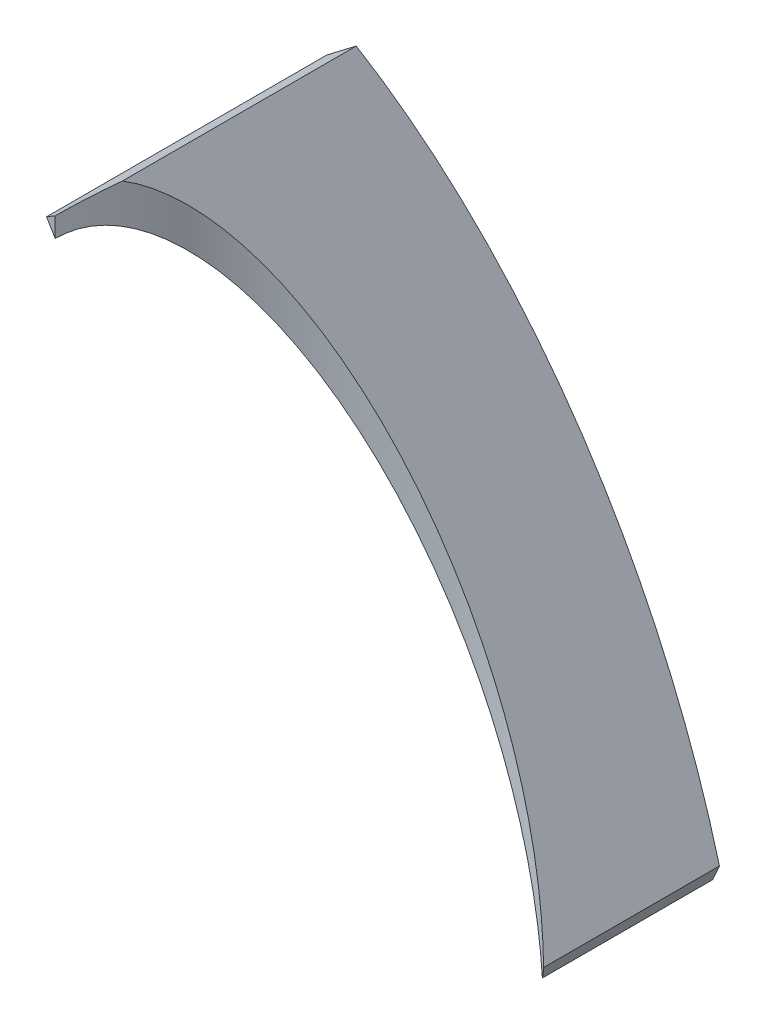
ISO-10303-21;
HEADER;
FILE_DESCRIPTION(('STEP AP214'),'2;1');
FILE_NAME('part.step','',(''),(''),'','','');
FILE_SCHEMA(('AUTOMOTIVE_DESIGN { 1 0 10303 214 1 1 1 1 }'));
ENDSEC;
DATA;
#1=APPLICATION_CONTEXT('core data for automotive mechanical design processes');
#2=APPLICATION_PROTOCOL_DEFINITION('international standard','automotive_design',2000,#1);
#3=PRODUCT_CONTEXT('',#1,'mechanical');
#4=PRODUCT('Part','Part','',(#3));
#5=PRODUCT_RELATED_PRODUCT_CATEGORY('part','',(#4));
#6=PRODUCT_DEFINITION_FORMATION('','',#4);
#7=PRODUCT_DEFINITION_CONTEXT('part definition',#1,'design');
#8=PRODUCT_DEFINITION('design','',#6,#7);
#9=PRODUCT_DEFINITION_SHAPE('','',#8);
#10=(LENGTH_UNIT() NAMED_UNIT(*) SI_UNIT(.MILLI.,.METRE.));
#11=(NAMED_UNIT(*) PLANE_ANGLE_UNIT() SI_UNIT($,.RADIAN.));
#12=(NAMED_UNIT(*) SI_UNIT($,.STERADIAN.) SOLID_ANGLE_UNIT());
#13=UNCERTAINTY_MEASURE_WITH_UNIT(LENGTH_MEASURE(1.E-05),#10,'distance_accuracy_value','');
#14=(GEOMETRIC_REPRESENTATION_CONTEXT(3) GLOBAL_UNCERTAINTY_ASSIGNED_CONTEXT((#13)) GLOBAL_UNIT_ASSIGNED_CONTEXT((#10,
#11,#12)) REPRESENTATION_CONTEXT('',''));
#15=CARTESIAN_POINT('',(0.,0.,0.));
#16=DIRECTION('',(0.,0.,1.));
#17=DIRECTION('',(1.,0.,0.));
#18=AXIS2_PLACEMENT_3D('',#15,#16,#17);
#19=CARTESIAN_POINT('',(0.,-0.0100000000000347,0.));
#20=DIRECTION('',(0.,1.,0.));
#21=DIRECTION('',(0.,0.,1.));
#22=AXIS2_PLACEMENT_3D('',#19,#20,#21);
#23=CYLINDRICAL_SURFACE('',#22,30.);
#24=CARTESIAN_POINT('',(0.,51.961524227067,0.));
#25=DIRECTION('',(0.866025403784442,-0.499999999999995,0.));
#26=DIRECTION('',(0.499999999999995,0.866025403784442,0.));
#27=AXIS2_PLACEMENT_3D('',#24,#25,#26);
#28=ELLIPSE('',#27,60.0000000000006,30.);
#29=CARTESIAN_POINT('',(19.161051284546,85.1494385783341,-23.0836330258259));
#30=VERTEX_POINT('',#29);
#31=CARTESIAN_POINT('',(20.8766842958356,88.12100212103,-21.5444668723088));
#32=VERTEX_POINT('',#31);
#33=EDGE_CURVE('E86',#30,#32,#28,.T.);
#34=ORIENTED_EDGE('',*,*,#33,.T.);
#35=CARTESIAN_POINT('',(0.,122.915475947423,0.));
#36=DIRECTION('',(-0.857492925712544,-0.514495755427527,0.));
#37=DIRECTION('',(0.514495755427526,-0.857492925712544,0.));
#38=AXIS2_PLACEMENT_3D('',#35,#36,#37);
#39=ELLIPSE('',#38,58.309518948453,30.);
#40=CARTESIAN_POINT('',(-28.7137606114312,170.771743633141,-8.69022160531155));
#41=VERTEX_POINT('',#40);
#42=EDGE_CURVE('E103',#41,#32,#39,.T.);
#43=ORIENTED_EDGE('',*,*,#42,.F.);
#44=CARTESIAN_POINT('',(0.,188.,0.));
#45=DIRECTION('',(0.514495755427527,-0.857492925712544,0.));
#46=DIRECTION('',(-0.857492925712544,-0.514495755427527,0.));
#47=AXIS2_PLACEMENT_3D('',#44,#45,#46);
#48=ELLIPSE('',#47,34.9857113690718,30.);
#49=CARTESIAN_POINT('',(-30.,170.,0.));
#50=VERTEX_POINT('',#49);
#51=EDGE_CURVE('E101',#50,#41,#48,.T.);
#52=ORIENTED_EDGE('',*,*,#51,.F.);
#53=DIRECTION('',(0.,-1.,0.));
#54=VECTOR('',#53,1.);
#55=CARTESIAN_POINT('',(-30.,190.,0.));
#56=LINE('',#55,#54);
#57=CARTESIAN_POINT('',(-30.,167.084524052577,0.));
#58=VERTEX_POINT('',#57);
#59=EDGE_CURVE('E89',#58,#50,#56,.F.);
#60=ORIENTED_EDGE('',*,*,#59,.F.);
#61=CARTESIAN_POINT('',(0.,117.084524052577,0.));
#62=DIRECTION('',(-0.857492925712544,-0.514495755427527,0.));
#63=DIRECTION('',(0.514495755427526,-0.857492925712544,0.));
#64=AXIS2_PLACEMENT_3D('',#61,#62,#63);
#65=ELLIPSE('',#64,58.309518948453,30.);
#66=EDGE_CURVE('E38',#58,#30,#65,.T.);
#67=ORIENTED_EDGE('',*,*,#66,.T.);
#68=EDGE_LOOP('',(#34,#43,#52,#60,#67));
#69=FACE_BOUND('',#68,.T.);
#70=ADVANCED_FACE('F34',(#69),#23,.F.);
#71=CARTESIAN_POINT('',(-30.,0.,-52.01));
#72=DIRECTION('',(0.866025403784442,-0.499999999999995,0.));
#73=DIRECTION('',(0.499999999999995,0.866025403784442,0.));
#74=AXIS2_PLACEMENT_3D('',#71,#72,#73);
#75=PLANE('',#74);
#76=ORIENTED_EDGE('',*,*,#33,.F.);
#77=DIRECTION('',(0.,0.,1.));
#78=VECTOR('',#77,1.);
#79=CARTESIAN_POINT('',(19.161051284546,85.1494385783341,0.));
#80=LINE('',#79,#78);
#81=CARTESIAN_POINT('',(19.161051284546,85.1494385783341,-48.341018955655));
#82=VERTEX_POINT('',#81);
#83=EDGE_CURVE('E97',#82,#30,#80,.T.);
#84=ORIENTED_EDGE('',*,*,#83,.F.);
#85=CARTESIAN_POINT('',(0.,51.961524227067,0.));
#86=DIRECTION('',(0.866025403784442,-0.499999999999995,0.));
#87=DIRECTION('',(0.499999999999995,0.866025403784442,0.));
#88=AXIS2_PLACEMENT_3D('',#85,#86,#87);
#89=ELLIPSE('',#88,104.000000000001,52.);
#90=CARTESIAN_POINT('',(20.8766842958356,88.12100212103,-47.6252459606458));
#91=VERTEX_POINT('',#90);
#92=EDGE_CURVE('E123',#82,#91,#89,.T.);
#93=ORIENTED_EDGE('',*,*,#92,.T.);
#94=DIRECTION('',(0.,0.,1.));
#95=VECTOR('',#94,1.);
#96=CARTESIAN_POINT('',(20.8766842958356,88.12100212103,0.));
#97=LINE('',#96,#95);
#98=EDGE_CURVE('E99',#91,#32,#97,.T.);
#99=ORIENTED_EDGE('',*,*,#98,.T.);
#100=EDGE_LOOP('',(#76,#84,#93,#99));
#101=FACE_BOUND('',#100,.T.);
#102=ADVANCED_FACE('F95',(#101),#75,.T.);
#103=CARTESIAN_POINT('',(54.2274158591571,32.5364495154942,0.));
#104=DIRECTION('',(-0.857492925712544,-0.514495755427527,0.));
#105=DIRECTION('',(0.514495755427526,-0.857492925712544,0.));
#106=AXIS2_PLACEMENT_3D('',#103,#104,#105);
#107=PLANE('',#106);
#108=CARTESIAN_POINT('',(0.,122.915475947423,0.));
#109=DIRECTION('',(-0.857492925712544,-0.514495755427527,0.));
#110=DIRECTION('',(-0.514495755427526,0.857492925712544,0.));
#111=AXIS2_PLACEMENT_3D('',#108,#109,#110);
#112=ELLIPSE('',#111,101.069832843985,52.);
#113=CARTESIAN_POINT('',(-28.7137606114312,170.771743633141,-43.3534306779685));
#114=VERTEX_POINT('',#113);
#115=EDGE_CURVE('E43',#114,#91,#112,.T.);
#116=ORIENTED_EDGE('',*,*,#115,.F.);
#117=DIRECTION('',(0.,0.,-1.));
#118=VECTOR('',#117,1.);
#119=CARTESIAN_POINT('',(-28.7137606114312,170.771743633141,0.));
#120=LINE('',#119,#118);
#121=EDGE_CURVE('E51',#41,#114,#120,.T.);
#122=ORIENTED_EDGE('',*,*,#121,.F.);
#123=ORIENTED_EDGE('',*,*,#42,.T.);
#124=ORIENTED_EDGE('',*,*,#98,.F.);
#125=EDGE_LOOP('',(#116,#122,#123,#124));
#126=FACE_BOUND('',#125,.T.);
#127=ADVANCED_FACE('F125',(#126),#107,.F.);
#128=CARTESIAN_POINT('',(-31.2862393885688,169.228256366859,0.));
#129=DIRECTION('',(0.,0.,-1.));
#130=DIRECTION('',(-1.,0.,0.));
#131=AXIS2_PLACEMENT_3D('',#128,#129,#130);
#132=PLANE('',#131);
#133=DIRECTION('',(-0.514495755427526,0.857492925712544,0.));
#134=VECTOR('',#133,1.);
#135=CARTESIAN_POINT('',(-31.2862393885688,169.228256366859,0.));
#136=LINE('',#135,#134);
#137=CARTESIAN_POINT('',(-31.2862393885688,169.228256366859,0.));
#138=VERTEX_POINT('',#137);
#139=EDGE_CURVE('E111',#58,#138,#136,.T.);
#140=ORIENTED_EDGE('',*,*,#139,.F.);
#141=ORIENTED_EDGE('',*,*,#59,.T.);
#142=DIRECTION('',(0.857492925712544,0.514495755427527,0.));
#143=VECTOR('',#142,1.);
#144=CARTESIAN_POINT('',(-31.2862393885688,169.228256366859,0.));
#145=LINE('',#144,#143);
#146=EDGE_CURVE('E114',#138,#50,#145,.T.);
#147=ORIENTED_EDGE('',*,*,#146,.F.);
#148=EDGE_LOOP('',(#140,#141,#147));
#149=FACE_BOUND('',#148,.T.);
#150=ADVANCED_FACE('F121',(#149),#132,.F.);
#151=CARTESIAN_POINT('',(51.6549370820194,30.9929622492117,0.));
#152=DIRECTION('',(-0.857492925712544,-0.514495755427527,0.));
#153=DIRECTION('',(0.514495755427526,-0.857492925712544,0.));
#154=AXIS2_PLACEMENT_3D('',#151,#152,#153);
#155=PLANE('',#154);
#156=DIRECTION('',(0.,0.,-1.));
#157=VECTOR('',#156,1.);
#158=CARTESIAN_POINT('',(-31.2862393885688,169.228256366859,0.));
#159=LINE('',#158,#157);
#160=CARTESIAN_POINT('',(-31.2862393885688,169.228256366859,-41.5351805692616));
#161=VERTEX_POINT('',#160);
#162=EDGE_CURVE('E110',#138,#161,#159,.T.);
#163=ORIENTED_EDGE('',*,*,#162,.T.);
#164=CARTESIAN_POINT('',(0.,117.084524052577,0.));
#165=DIRECTION('',(-0.857492925712544,-0.514495755427527,0.));
#166=DIRECTION('',(-0.514495755427526,0.857492925712544,0.));
#167=AXIS2_PLACEMENT_3D('',#164,#165,#166);
#168=ELLIPSE('',#167,101.069832843985,52.);
#169=EDGE_CURVE('E58',#161,#82,#168,.T.);
#170=ORIENTED_EDGE('',*,*,#169,.T.);
#171=ORIENTED_EDGE('',*,*,#83,.T.);
#172=ORIENTED_EDGE('',*,*,#66,.F.);
#173=ORIENTED_EDGE('',*,*,#139,.T.);
#174=EDGE_LOOP('',(#163,#170,#171,#172,#173));
#175=FACE_BOUND('',#174,.T.);
#176=ADVANCED_FACE('F100',(#175),#155,.T.);
#177=CARTESIAN_POINT('',(0.,-0.01,0.));
#178=DIRECTION('',(0.,1.,0.));
#179=DIRECTION('',(0.,0.,1.));
#180=AXIS2_PLACEMENT_3D('',#177,#178,#179);
#181=CYLINDRICAL_SURFACE('',#180,52.);
#182=ORIENTED_EDGE('',*,*,#92,.F.);
#183=ORIENTED_EDGE('',*,*,#169,.F.);
#184=CARTESIAN_POINT('',(0.,188.,0.));
#185=DIRECTION('',(0.514495755427527,-0.857492925712544,0.));
#186=DIRECTION('',(0.857492925712544,0.514495755427527,0.));
#187=AXIS2_PLACEMENT_3D('',#184,#185,#186);
#188=ELLIPSE('',#187,60.6418997063911,52.);
#189=EDGE_CURVE('E11',#161,#114,#188,.T.);
#190=ORIENTED_EDGE('',*,*,#189,.T.);
#191=ORIENTED_EDGE('',*,*,#115,.T.);
#192=EDGE_LOOP('',(#182,#183,#190,#191));
#193=FACE_BOUND('',#192,.T.);
#194=ADVANCED_FACE('F36',(#193),#181,.T.);
#195=CARTESIAN_POINT('',(-31.2862393885688,169.228256366859,0.));
#196=DIRECTION('',(0.514495755427527,-0.857492925712544,0.));
#197=DIRECTION('',(0.857492925712544,0.514495755427527,0.));
#198=AXIS2_PLACEMENT_3D('',#195,#196,#197);
#199=PLANE('',#198);
#200=ORIENTED_EDGE('',*,*,#189,.F.);
#201=ORIENTED_EDGE('',*,*,#162,.F.);
#202=ORIENTED_EDGE('',*,*,#146,.T.);
#203=ORIENTED_EDGE('',*,*,#51,.T.);
#204=ORIENTED_EDGE('',*,*,#121,.T.);
#205=EDGE_LOOP('',(#200,#201,#202,#203,#204));
#206=FACE_BOUND('',#205,.T.);
#207=ADVANCED_FACE('F122',(#206),#199,.F.);
#208=CLOSED_SHELL('',(#70,#102,#127,#150,#176,#194,#207));
#209=MANIFOLD_SOLID_BREP('B2',#208);
#210=ADVANCED_BREP_SHAPE_REPRESENTATION('',(#18,#209),#14);
#211=SHAPE_DEFINITION_REPRESENTATION(#9,#210);
ENDSEC;
END-ISO-10303-21;
